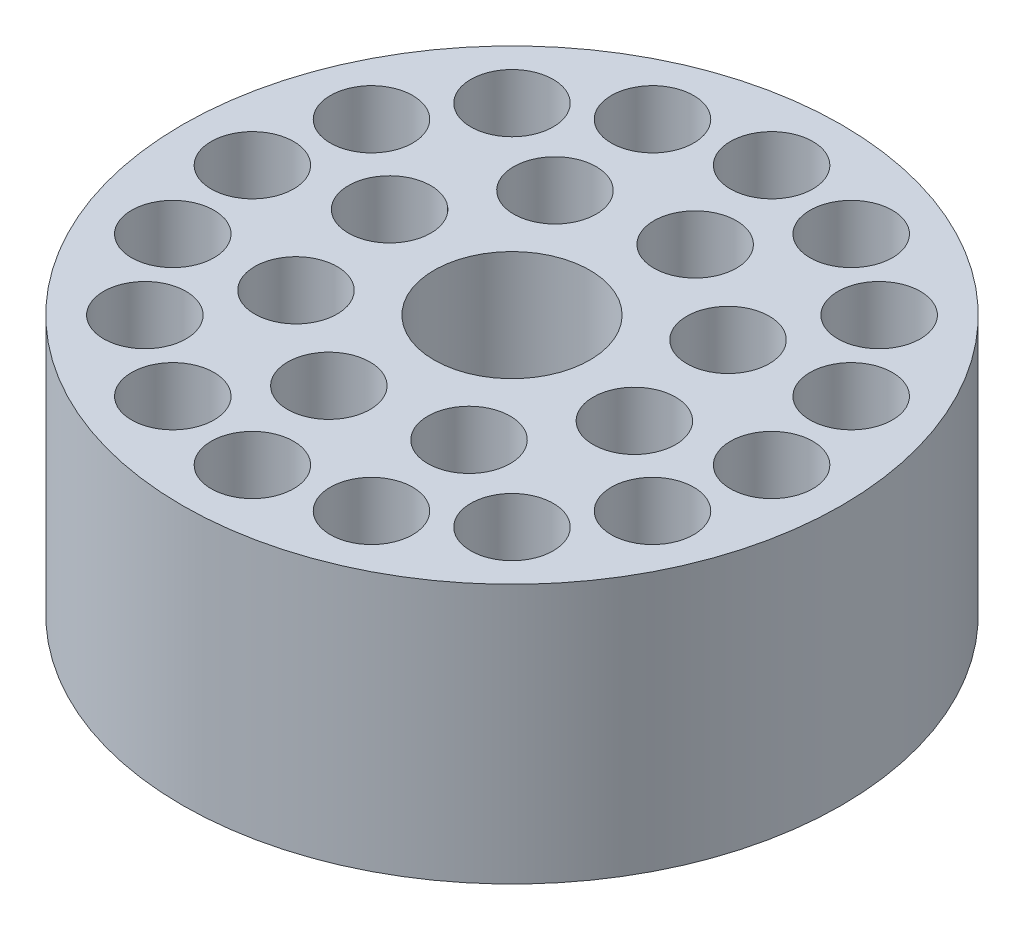
ISO-10303-21;
HEADER;
FILE_DESCRIPTION(('STEP AP214'),'2;1');
FILE_NAME('part.step','',(''),(''),'','','');
FILE_SCHEMA(('AUTOMOTIVE_DESIGN { 1 0 10303 214 1 1 1 1 }'));
ENDSEC;
DATA;
#1=APPLICATION_CONTEXT('core data for automotive mechanical design processes');
#2=APPLICATION_PROTOCOL_DEFINITION('international standard','automotive_design',2000,#1);
#3=PRODUCT_CONTEXT('',#1,'mechanical');
#4=PRODUCT('Part','Part','',(#3));
#5=PRODUCT_RELATED_PRODUCT_CATEGORY('part','',(#4));
#6=PRODUCT_DEFINITION_FORMATION('','',#4);
#7=PRODUCT_DEFINITION_CONTEXT('part definition',#1,'design');
#8=PRODUCT_DEFINITION('design','',#6,#7);
#9=PRODUCT_DEFINITION_SHAPE('','',#8);
#10=(LENGTH_UNIT() NAMED_UNIT(*) SI_UNIT(.MILLI.,.METRE.));
#11=(NAMED_UNIT(*) PLANE_ANGLE_UNIT() SI_UNIT($,.RADIAN.));
#12=(NAMED_UNIT(*) SI_UNIT($,.STERADIAN.) SOLID_ANGLE_UNIT());
#13=UNCERTAINTY_MEASURE_WITH_UNIT(LENGTH_MEASURE(1.E-05),#10,'distance_accuracy_value','');
#14=(GEOMETRIC_REPRESENTATION_CONTEXT(3) GLOBAL_UNCERTAINTY_ASSIGNED_CONTEXT((#13)) GLOBAL_UNIT_ASSIGNED_CONTEXT((#10,
#11,#12)) REPRESENTATION_CONTEXT('',''));
#15=CARTESIAN_POINT('',(0.,0.,0.));
#16=DIRECTION('',(0.,0.,1.));
#17=DIRECTION('',(1.,0.,0.));
#18=AXIS2_PLACEMENT_3D('',#15,#16,#17);
#19=CARTESIAN_POINT('',(0.,5.,0.));
#20=DIRECTION('',(0.,-1.,0.));
#21=DIRECTION('',(0.,0.,-1.));
#22=AXIS2_PLACEMENT_3D('',#19,#20,#21);
#23=CYLINDRICAL_SURFACE('',#22,6.35);
#24=CARTESIAN_POINT('',(0.,5.,0.));
#25=DIRECTION('',(0.,1.,0.));
#26=DIRECTION('',(0.,0.,1.));
#27=AXIS2_PLACEMENT_3D('',#24,#25,#26);
#28=CIRCLE('',#27,6.35);
#29=CARTESIAN_POINT('',(0.,5.,6.35));
#30=VERTEX_POINT('',#29);
#31=EDGE_CURVE('E10',#30,#30,#28,.T.);
#32=ORIENTED_EDGE('',*,*,#31,.F.);
#33=EDGE_LOOP('',(#32));
#34=FACE_BOUND('',#33,.T.);
#35=CARTESIAN_POINT('',(0.,0.,0.));
#36=DIRECTION('',(0.,1.,0.));
#37=DIRECTION('',(0.,0.,1.));
#38=AXIS2_PLACEMENT_3D('',#35,#36,#37);
#39=CIRCLE('',#38,6.35);
#40=CARTESIAN_POINT('',(0.,0.,6.35));
#41=VERTEX_POINT('',#40);
#42=EDGE_CURVE('E33',#41,#41,#39,.T.);
#43=ORIENTED_EDGE('',*,*,#42,.T.);
#44=EDGE_LOOP('',(#43));
#45=FACE_BOUND('',#44,.T.);
#46=ADVANCED_FACE('F30',(#34,#45),#23,.T.);
#47=CARTESIAN_POINT('',(0.,5.,0.));
#48=DIRECTION('',(0.,1.,0.));
#49=DIRECTION('',(0.,0.,1.));
#50=AXIS2_PLACEMENT_3D('',#47,#48,#49);
#51=PLANE('',#50);
#52=CARTESIAN_POINT('',(0.,5.,0.));
#53=DIRECTION('',(0.,1.,0.));
#54=DIRECTION('',(0.,0.,1.));
#55=AXIS2_PLACEMENT_3D('',#52,#53,#54);
#56=CIRCLE('',#55,1.5);
#57=CARTESIAN_POINT('',(0.,5.,1.5));
#58=VERTEX_POINT('',#57);
#59=EDGE_CURVE('E186',#58,#58,#56,.T.);
#60=ORIENTED_EDGE('',*,*,#59,.F.);
#61=EDGE_LOOP('',(#60));
#62=FACE_BOUND('',#61,.T.);
#63=CARTESIAN_POINT('',(2.4944088369076,5.,-1.66671069905885));
#64=DIRECTION('',(0.,1.,0.));
#65=DIRECTION('',(-0.707106781186539,0.,0.707106781186556));
#66=AXIS2_PLACEMENT_3D('',#63,#64,#65);
#67=CIRCLE('',#66,0.793750000000001);
#68=CARTESIAN_POINT('',(1.93314282934079,5.,-1.10544469149202));
#69=VERTEX_POINT('',#68);
#70=EDGE_CURVE('E180',#69,#69,#67,.T.);
#71=ORIENTED_EDGE('',*,*,#70,.F.);
#72=EDGE_LOOP('',(#71));
#73=FACE_BOUND('',#72,.T.);
#74=CARTESIAN_POINT('',(2.9423558412097,5.,0.585270966048334));
#75=DIRECTION('',(0.,1.,0.));
#76=DIRECTION('',(-1.,0.,0.));
#77=AXIS2_PLACEMENT_3D('',#74,#75,#76);
#78=CIRCLE('',#77,0.793750000000001);
#79=CARTESIAN_POINT('',(2.1486058412097,5.,0.585270966048343));
#80=VERTEX_POINT('',#79);
#81=EDGE_CURVE('E174',#80,#80,#78,.T.);
#82=ORIENTED_EDGE('',*,*,#81,.F.);
#83=EDGE_LOOP('',(#82));
#84=FACE_BOUND('',#83,.T.);
#85=CARTESIAN_POINT('',(1.66671069905885,5.,2.49440883690761));
#86=DIRECTION('',(0.,1.,0.));
#87=DIRECTION('',(-0.707106781186554,0.,-0.707106781186541));
#88=AXIS2_PLACEMENT_3D('',#85,#86,#87);
#89=CIRCLE('',#88,0.793750000000001);
#90=CARTESIAN_POINT('',(1.10544469149202,5.,1.93314282934079));
#91=VERTEX_POINT('',#90);
#92=EDGE_CURVE('E168',#91,#91,#89,.T.);
#93=ORIENTED_EDGE('',*,*,#92,.F.);
#94=EDGE_LOOP('',(#93));
#95=FACE_BOUND('',#94,.T.);
#96=CARTESIAN_POINT('',(-0.585270966048365,5.,2.9423558412097));
#97=DIRECTION('',(0.,1.,0.));
#98=DIRECTION('',(0.,0.,-1.));
#99=AXIS2_PLACEMENT_3D('',#96,#97,#98);
#100=CIRCLE('',#99,0.793750000000001);
#101=CARTESIAN_POINT('',(-0.585270966048365,5.,2.14860584120969));
#102=VERTEX_POINT('',#101);
#103=EDGE_CURVE('E162',#102,#102,#100,.T.);
#104=ORIENTED_EDGE('',*,*,#103,.F.);
#105=EDGE_LOOP('',(#104));
#106=FACE_BOUND('',#105,.T.);
#107=CARTESIAN_POINT('',(-2.49440883690762,5.,1.66671069905884));
#108=DIRECTION('',(0.,1.,0.));
#109=DIRECTION('',(0.707106781186544,0.,-0.707106781186551));
#110=AXIS2_PLACEMENT_3D('',#107,#108,#109);
#111=CIRCLE('',#110,0.793750000000001);
#112=CARTESIAN_POINT('',(-1.9331428293408,5.,1.10544469149201));
#113=VERTEX_POINT('',#112);
#114=EDGE_CURVE('E156',#113,#113,#111,.T.);
#115=ORIENTED_EDGE('',*,*,#114,.F.);
#116=EDGE_LOOP('',(#115));
#117=FACE_BOUND('',#116,.T.);
#118=CARTESIAN_POINT('',(-2.9423558412097,5.,-0.585270966048355));
#119=DIRECTION('',(0.,1.,0.));
#120=DIRECTION('',(1.,0.,0.));
#121=AXIS2_PLACEMENT_3D('',#118,#119,#120);
#122=CIRCLE('',#121,0.793750000000001);
#123=CARTESIAN_POINT('',(-2.1486058412097,5.,-0.585270966048357));
#124=VERTEX_POINT('',#123);
#125=EDGE_CURVE('E150',#124,#124,#122,.T.);
#126=ORIENTED_EDGE('',*,*,#125,.F.);
#127=EDGE_LOOP('',(#126));
#128=FACE_BOUND('',#127,.T.);
#129=CARTESIAN_POINT('',(-1.66671069905883,5.,-2.49440883690762));
#130=DIRECTION('',(0.,1.,0.));
#131=DIRECTION('',(0.707106781186549,0.,0.707106781186546));
#132=AXIS2_PLACEMENT_3D('',#129,#130,#131);
#133=CIRCLE('',#132,0.793750000000001);
#134=CARTESIAN_POINT('',(-1.105444691492,5.,-1.9331428293408));
#135=VERTEX_POINT('',#134);
#136=EDGE_CURVE('E144',#135,#135,#133,.T.);
#137=ORIENTED_EDGE('',*,*,#136,.F.);
#138=EDGE_LOOP('',(#137));
#139=FACE_BOUND('',#138,.T.);
#140=CARTESIAN_POINT('',(0.585270966048365,5.,-2.9423558412097));
#141=DIRECTION('',(0.,1.,0.));
#142=DIRECTION('',(0.,0.,1.));
#143=AXIS2_PLACEMENT_3D('',#140,#141,#142);
#144=CIRCLE('',#143,0.793750000000001);
#145=CARTESIAN_POINT('',(0.585270966048365,5.,-2.14860584120969));
#146=VERTEX_POINT('',#145);
#147=EDGE_CURVE('E138',#146,#146,#144,.T.);
#148=ORIENTED_EDGE('',*,*,#147,.F.);
#149=EDGE_LOOP('',(#148));
#150=FACE_BOUND('',#149,.T.);
#151=CARTESIAN_POINT('',(1.91341716182539,5.,-4.61939766255646));
#152=DIRECTION('',(0.,1.,0.));
#153=DIRECTION('',(-0.382683432365077,0.,0.923879532511292));
#154=AXIS2_PLACEMENT_3D('',#151,#152,#153);
#155=CIRCLE('',#154,0.79375);
#156=CARTESIAN_POINT('',(1.60966218738561,5.,-3.88606828362562));
#157=VERTEX_POINT('',#156);
#158=EDGE_CURVE('E132',#157,#157,#155,.T.);
#159=ORIENTED_EDGE('',*,*,#158,.F.);
#160=EDGE_LOOP('',(#159));
#161=FACE_BOUND('',#160,.T.);
#162=CARTESIAN_POINT('',(3.53553390593269,5.,-3.53553390593278));
#163=DIRECTION('',(0.,1.,0.));
#164=DIRECTION('',(-0.707106781186539,0.,0.707106781186556));
#165=AXIS2_PLACEMENT_3D('',#162,#163,#164);
#166=CIRCLE('',#165,0.79375);
#167=CARTESIAN_POINT('',(2.97426789836588,5.,-2.97426789836595));
#168=VERTEX_POINT('',#167);
#169=EDGE_CURVE('E126',#168,#168,#166,.T.);
#170=ORIENTED_EDGE('',*,*,#169,.F.);
#171=EDGE_LOOP('',(#170));
#172=FACE_BOUND('',#171,.T.);
#173=CARTESIAN_POINT('',(4.61939766255641,5.,-1.9134171618255));
#174=DIRECTION('',(0.,1.,0.));
#175=DIRECTION('',(-0.923879532511283,0.,0.3826834323651));
#176=AXIS2_PLACEMENT_3D('',#173,#174,#175);
#177=CIRCLE('',#176,0.79375);
#178=CARTESIAN_POINT('',(3.88606828362558,5.,-1.6096621873857));
#179=VERTEX_POINT('',#178);
#180=EDGE_CURVE('E120',#179,#179,#177,.T.);
#181=ORIENTED_EDGE('',*,*,#180,.F.);
#182=EDGE_LOOP('',(#181));
#183=FACE_BOUND('',#182,.T.);
#184=CARTESIAN_POINT('',(5.,5.,0.));
#185=DIRECTION('',(0.,1.,0.));
#186=DIRECTION('',(-1.,0.,0.));
#187=AXIS2_PLACEMENT_3D('',#184,#185,#186);
#188=CIRCLE('',#187,0.79375);
#189=CARTESIAN_POINT('',(4.20625,5.,0.));
#190=VERTEX_POINT('',#189);
#191=EDGE_CURVE('E114',#190,#190,#188,.T.);
#192=ORIENTED_EDGE('',*,*,#191,.F.);
#193=EDGE_LOOP('',(#192));
#194=FACE_BOUND('',#193,.T.);
#195=CARTESIAN_POINT('',(4.61939766255645,5.,1.9134171618254));
#196=DIRECTION('',(0.,1.,0.));
#197=DIRECTION('',(-0.923879532511291,0.,-0.382683432365081));
#198=AXIS2_PLACEMENT_3D('',#195,#196,#197);
#199=CIRCLE('',#198,0.79375);
#200=CARTESIAN_POINT('',(3.88606828362562,5.,1.60966218738562));
#201=VERTEX_POINT('',#200);
#202=EDGE_CURVE('E108',#201,#201,#199,.T.);
#203=ORIENTED_EDGE('',*,*,#202,.F.);
#204=EDGE_LOOP('',(#203));
#205=FACE_BOUND('',#204,.T.);
#206=CARTESIAN_POINT('',(3.53553390593277,5.,3.53553390593271));
#207=DIRECTION('',(0.,1.,0.));
#208=DIRECTION('',(-0.707106781186554,0.,-0.707106781186541));
#209=AXIS2_PLACEMENT_3D('',#206,#207,#208);
#210=CIRCLE('',#209,0.79375);
#211=CARTESIAN_POINT('',(2.97426789836594,5.,2.97426789836589));
#212=VERTEX_POINT('',#211);
#213=EDGE_CURVE('E102',#212,#212,#210,.T.);
#214=ORIENTED_EDGE('',*,*,#213,.F.);
#215=EDGE_LOOP('',(#214));
#216=FACE_BOUND('',#215,.T.);
#217=CARTESIAN_POINT('',(1.91341716182549,5.,4.61939766255642));
#218=DIRECTION('',(0.,1.,0.));
#219=DIRECTION('',(-0.382683432365097,0.,-0.923879532511284));
#220=AXIS2_PLACEMENT_3D('',#217,#218,#219);
#221=CIRCLE('',#220,0.79375);
#222=CARTESIAN_POINT('',(1.60966218738569,5.,3.88606828362559));
#223=VERTEX_POINT('',#222);
#224=EDGE_CURVE('E96',#223,#223,#221,.T.);
#225=ORIENTED_EDGE('',*,*,#224,.F.);
#226=EDGE_LOOP('',(#225));
#227=FACE_BOUND('',#226,.T.);
#228=CARTESIAN_POINT('',(0.,5.,5.));
#229=DIRECTION('',(0.,1.,0.));
#230=DIRECTION('',(0.,0.,-1.));
#231=AXIS2_PLACEMENT_3D('',#228,#229,#230);
#232=CIRCLE('',#231,0.79375);
#233=CARTESIAN_POINT('',(0.,5.,4.20625));
#234=VERTEX_POINT('',#233);
#235=EDGE_CURVE('E90',#234,#234,#232,.T.);
#236=ORIENTED_EDGE('',*,*,#235,.F.);
#237=EDGE_LOOP('',(#236));
#238=FACE_BOUND('',#237,.T.);
#239=CARTESIAN_POINT('',(-1.91341716182542,5.,4.61939766255645));
#240=DIRECTION('',(0.,1.,0.));
#241=DIRECTION('',(0.382683432365084,0.,-0.923879532511289));
#242=AXIS2_PLACEMENT_3D('',#239,#240,#241);
#243=CIRCLE('',#242,0.79375);
#244=CARTESIAN_POINT('',(-1.60966218738564,5.,3.88606828362561));
#245=VERTEX_POINT('',#244);
#246=EDGE_CURVE('E84',#245,#245,#243,.T.);
#247=ORIENTED_EDGE('',*,*,#246,.F.);
#248=EDGE_LOOP('',(#247));
#249=FACE_BOUND('',#248,.T.);
#250=CARTESIAN_POINT('',(-3.53553390593272,5.,3.53553390593276));
#251=DIRECTION('',(0.,1.,0.));
#252=DIRECTION('',(0.707106781186544,0.,-0.707106781186551));
#253=AXIS2_PLACEMENT_3D('',#250,#251,#252);
#254=CIRCLE('',#253,0.79375);
#255=CARTESIAN_POINT('',(-2.9742678983659,5.,2.97426789836593));
#256=VERTEX_POINT('',#255);
#257=EDGE_CURVE('E78',#256,#256,#254,.T.);
#258=ORIENTED_EDGE('',*,*,#257,.F.);
#259=EDGE_LOOP('',(#258));
#260=FACE_BOUND('',#259,.T.);
#261=CARTESIAN_POINT('',(-4.61939766255643,5.,1.91341716182547));
#262=DIRECTION('',(0.,1.,0.));
#263=DIRECTION('',(0.923879532511285,0.,-0.382683432365094));
#264=AXIS2_PLACEMENT_3D('',#261,#262,#263);
#265=CIRCLE('',#264,0.79375);
#266=CARTESIAN_POINT('',(-3.88606828362559,5.,1.60966218738568));
#267=VERTEX_POINT('',#266);
#268=EDGE_CURVE('E72',#267,#267,#265,.T.);
#269=ORIENTED_EDGE('',*,*,#268,.F.);
#270=EDGE_LOOP('',(#269));
#271=FACE_BOUND('',#270,.T.);
#272=CARTESIAN_POINT('',(-5.,5.,0.));
#273=DIRECTION('',(0.,1.,0.));
#274=DIRECTION('',(1.,0.,0.));
#275=AXIS2_PLACEMENT_3D('',#272,#273,#274);
#276=CIRCLE('',#275,0.79375);
#277=CARTESIAN_POINT('',(-4.20625,5.,0.));
#278=VERTEX_POINT('',#277);
#279=EDGE_CURVE('E66',#278,#278,#276,.T.);
#280=ORIENTED_EDGE('',*,*,#279,.F.);
#281=EDGE_LOOP('',(#280));
#282=FACE_BOUND('',#281,.T.);
#283=CARTESIAN_POINT('',(-4.61939766255644,5.,-1.91341716182544));
#284=DIRECTION('',(0.,1.,0.));
#285=DIRECTION('',(0.923879532511288,0.,0.382683432365087));
#286=AXIS2_PLACEMENT_3D('',#283,#284,#285);
#287=CIRCLE('',#286,0.79375);
#288=CARTESIAN_POINT('',(-3.8860682836256,5.,-1.60966218738565));
#289=VERTEX_POINT('',#288);
#290=EDGE_CURVE('E60',#289,#289,#287,.T.);
#291=ORIENTED_EDGE('',*,*,#290,.F.);
#292=EDGE_LOOP('',(#291));
#293=FACE_BOUND('',#292,.T.);
#294=CARTESIAN_POINT('',(-3.53553390593274,5.,-3.53553390593273));
#295=DIRECTION('',(0.,1.,0.));
#296=DIRECTION('',(0.707106781186549,0.,0.707106781186546));
#297=AXIS2_PLACEMENT_3D('',#294,#295,#296);
#298=CIRCLE('',#297,0.79375);
#299=CARTESIAN_POINT('',(-2.97426789836592,5.,-2.97426789836591));
#300=VERTEX_POINT('',#299);
#301=EDGE_CURVE('E54',#300,#300,#298,.T.);
#302=ORIENTED_EDGE('',*,*,#301,.F.);
#303=EDGE_LOOP('',(#302));
#304=FACE_BOUND('',#303,.T.);
#305=CARTESIAN_POINT('',(-1.91341716182545,5.,-4.61939766255643));
#306=DIRECTION('',(0.,1.,0.));
#307=DIRECTION('',(0.382683432365091,0.,0.923879532511287));
#308=AXIS2_PLACEMENT_3D('',#305,#306,#307);
#309=CIRCLE('',#308,0.79375);
#310=CARTESIAN_POINT('',(-1.60966218738566,5.,-3.8860682836256));
#311=VERTEX_POINT('',#310);
#312=EDGE_CURVE('E48',#311,#311,#309,.T.);
#313=ORIENTED_EDGE('',*,*,#312,.F.);
#314=EDGE_LOOP('',(#313));
#315=FACE_BOUND('',#314,.T.);
#316=CARTESIAN_POINT('',(0.,5.,-5.));
#317=DIRECTION('',(0.,1.,0.));
#318=DIRECTION('',(0.,0.,1.));
#319=AXIS2_PLACEMENT_3D('',#316,#317,#318);
#320=CIRCLE('',#319,0.79375);
#321=CARTESIAN_POINT('',(0.,5.,-4.20625));
#322=VERTEX_POINT('',#321);
#323=EDGE_CURVE('E42',#322,#322,#320,.T.);
#324=ORIENTED_EDGE('',*,*,#323,.F.);
#325=EDGE_LOOP('',(#324));
#326=FACE_BOUND('',#325,.T.);
#327=ORIENTED_EDGE('',*,*,#31,.T.);
#328=EDGE_LOOP('',(#327));
#329=FACE_BOUND('',#328,.T.);
#330=ADVANCED_FACE('F202',(#62,#73,#84,#95,#106,#117,#128,#139,#150,#161,#172,#183,#194,#205,
#216,#227,#238,#249,#260,#271,#282,#293,#304,#315,#326,#329),#51,.T.);
#331=CARTESIAN_POINT('',(0.,0.,0.));
#332=DIRECTION('',(0.,1.,0.));
#333=DIRECTION('',(0.,0.,1.));
#334=AXIS2_PLACEMENT_3D('',#331,#332,#333);
#335=PLANE('',#334);
#336=CARTESIAN_POINT('',(0.,0.,0.));
#337=DIRECTION('',(0.,1.,0.));
#338=DIRECTION('',(0.,0.,1.));
#339=AXIS2_PLACEMENT_3D('',#336,#337,#338);
#340=CIRCLE('',#339,1.5);
#341=CARTESIAN_POINT('',(0.,0.,1.5));
#342=VERTEX_POINT('',#341);
#343=EDGE_CURVE('E183',#342,#342,#340,.T.);
#344=ORIENTED_EDGE('',*,*,#343,.T.);
#345=EDGE_LOOP('',(#344));
#346=FACE_BOUND('',#345,.T.);
#347=CARTESIAN_POINT('',(2.4944088369076,0.,-1.66671069905885));
#348=DIRECTION('',(0.,1.,0.));
#349=DIRECTION('',(-0.707106781186539,0.,0.707106781186556));
#350=AXIS2_PLACEMENT_3D('',#347,#348,#349);
#351=CIRCLE('',#350,0.793750000000001);
#352=CARTESIAN_POINT('',(1.93314282934079,0.,-1.10544469149202));
#353=VERTEX_POINT('',#352);
#354=EDGE_CURVE('E177',#353,#353,#351,.T.);
#355=ORIENTED_EDGE('',*,*,#354,.T.);
#356=EDGE_LOOP('',(#355));
#357=FACE_BOUND('',#356,.T.);
#358=CARTESIAN_POINT('',(2.9423558412097,0.,0.585270966048334));
#359=DIRECTION('',(0.,1.,0.));
#360=DIRECTION('',(-1.,0.,0.));
#361=AXIS2_PLACEMENT_3D('',#358,#359,#360);
#362=CIRCLE('',#361,0.793750000000001);
#363=CARTESIAN_POINT('',(2.1486058412097,0.,0.585270966048343));
#364=VERTEX_POINT('',#363);
#365=EDGE_CURVE('E171',#364,#364,#362,.T.);
#366=ORIENTED_EDGE('',*,*,#365,.T.);
#367=EDGE_LOOP('',(#366));
#368=FACE_BOUND('',#367,.T.);
#369=CARTESIAN_POINT('',(1.66671069905885,0.,2.49440883690761));
#370=DIRECTION('',(0.,1.,0.));
#371=DIRECTION('',(-0.707106781186554,0.,-0.707106781186541));
#372=AXIS2_PLACEMENT_3D('',#369,#370,#371);
#373=CIRCLE('',#372,0.793750000000001);
#374=CARTESIAN_POINT('',(1.10544469149202,0.,1.93314282934079));
#375=VERTEX_POINT('',#374);
#376=EDGE_CURVE('E165',#375,#375,#373,.T.);
#377=ORIENTED_EDGE('',*,*,#376,.T.);
#378=EDGE_LOOP('',(#377));
#379=FACE_BOUND('',#378,.T.);
#380=CARTESIAN_POINT('',(-0.585270966048365,0.,2.9423558412097));
#381=DIRECTION('',(0.,1.,0.));
#382=DIRECTION('',(0.,0.,-1.));
#383=AXIS2_PLACEMENT_3D('',#380,#381,#382);
#384=CIRCLE('',#383,0.793750000000001);
#385=CARTESIAN_POINT('',(-0.585270966048365,0.,2.14860584120969));
#386=VERTEX_POINT('',#385);
#387=EDGE_CURVE('E159',#386,#386,#384,.T.);
#388=ORIENTED_EDGE('',*,*,#387,.T.);
#389=EDGE_LOOP('',(#388));
#390=FACE_BOUND('',#389,.T.);
#391=CARTESIAN_POINT('',(-2.49440883690762,0.,1.66671069905884));
#392=DIRECTION('',(0.,1.,0.));
#393=DIRECTION('',(0.707106781186544,0.,-0.707106781186551));
#394=AXIS2_PLACEMENT_3D('',#391,#392,#393);
#395=CIRCLE('',#394,0.793750000000001);
#396=CARTESIAN_POINT('',(-1.9331428293408,0.,1.10544469149201));
#397=VERTEX_POINT('',#396);
#398=EDGE_CURVE('E153',#397,#397,#395,.T.);
#399=ORIENTED_EDGE('',*,*,#398,.T.);
#400=EDGE_LOOP('',(#399));
#401=FACE_BOUND('',#400,.T.);
#402=CARTESIAN_POINT('',(-2.9423558412097,0.,-0.585270966048355));
#403=DIRECTION('',(0.,1.,0.));
#404=DIRECTION('',(1.,0.,0.));
#405=AXIS2_PLACEMENT_3D('',#402,#403,#404);
#406=CIRCLE('',#405,0.793750000000001);
#407=CARTESIAN_POINT('',(-2.1486058412097,0.,-0.585270966048357));
#408=VERTEX_POINT('',#407);
#409=EDGE_CURVE('E147',#408,#408,#406,.T.);
#410=ORIENTED_EDGE('',*,*,#409,.T.);
#411=EDGE_LOOP('',(#410));
#412=FACE_BOUND('',#411,.T.);
#413=CARTESIAN_POINT('',(-1.66671069905883,0.,-2.49440883690762));
#414=DIRECTION('',(0.,1.,0.));
#415=DIRECTION('',(0.707106781186549,0.,0.707106781186546));
#416=AXIS2_PLACEMENT_3D('',#413,#414,#415);
#417=CIRCLE('',#416,0.793750000000001);
#418=CARTESIAN_POINT('',(-1.105444691492,0.,-1.9331428293408));
#419=VERTEX_POINT('',#418);
#420=EDGE_CURVE('E141',#419,#419,#417,.T.);
#421=ORIENTED_EDGE('',*,*,#420,.T.);
#422=EDGE_LOOP('',(#421));
#423=FACE_BOUND('',#422,.T.);
#424=CARTESIAN_POINT('',(0.585270966048365,0.,-2.9423558412097));
#425=DIRECTION('',(0.,1.,0.));
#426=DIRECTION('',(0.,0.,1.));
#427=AXIS2_PLACEMENT_3D('',#424,#425,#426);
#428=CIRCLE('',#427,0.793750000000001);
#429=CARTESIAN_POINT('',(0.585270966048365,0.,-2.14860584120969));
#430=VERTEX_POINT('',#429);
#431=EDGE_CURVE('E135',#430,#430,#428,.T.);
#432=ORIENTED_EDGE('',*,*,#431,.T.);
#433=EDGE_LOOP('',(#432));
#434=FACE_BOUND('',#433,.T.);
#435=CARTESIAN_POINT('',(1.91341716182539,0.,-4.61939766255646));
#436=DIRECTION('',(0.,1.,0.));
#437=DIRECTION('',(-0.382683432365077,0.,0.923879532511292));
#438=AXIS2_PLACEMENT_3D('',#435,#436,#437);
#439=CIRCLE('',#438,0.79375);
#440=CARTESIAN_POINT('',(1.60966218738561,0.,-3.88606828362562));
#441=VERTEX_POINT('',#440);
#442=EDGE_CURVE('E129',#441,#441,#439,.T.);
#443=ORIENTED_EDGE('',*,*,#442,.T.);
#444=EDGE_LOOP('',(#443));
#445=FACE_BOUND('',#444,.T.);
#446=CARTESIAN_POINT('',(3.53553390593269,0.,-3.53553390593278));
#447=DIRECTION('',(0.,1.,0.));
#448=DIRECTION('',(-0.707106781186539,0.,0.707106781186556));
#449=AXIS2_PLACEMENT_3D('',#446,#447,#448);
#450=CIRCLE('',#449,0.79375);
#451=CARTESIAN_POINT('',(2.97426789836588,0.,-2.97426789836595));
#452=VERTEX_POINT('',#451);
#453=EDGE_CURVE('E123',#452,#452,#450,.T.);
#454=ORIENTED_EDGE('',*,*,#453,.T.);
#455=EDGE_LOOP('',(#454));
#456=FACE_BOUND('',#455,.T.);
#457=CARTESIAN_POINT('',(4.61939766255641,0.,-1.9134171618255));
#458=DIRECTION('',(0.,1.,0.));
#459=DIRECTION('',(-0.923879532511283,0.,0.3826834323651));
#460=AXIS2_PLACEMENT_3D('',#457,#458,#459);
#461=CIRCLE('',#460,0.79375);
#462=CARTESIAN_POINT('',(3.88606828362558,0.,-1.6096621873857));
#463=VERTEX_POINT('',#462);
#464=EDGE_CURVE('E117',#463,#463,#461,.T.);
#465=ORIENTED_EDGE('',*,*,#464,.T.);
#466=EDGE_LOOP('',(#465));
#467=FACE_BOUND('',#466,.T.);
#468=CARTESIAN_POINT('',(5.,0.,0.));
#469=DIRECTION('',(0.,1.,0.));
#470=DIRECTION('',(-1.,0.,0.));
#471=AXIS2_PLACEMENT_3D('',#468,#469,#470);
#472=CIRCLE('',#471,0.79375);
#473=CARTESIAN_POINT('',(4.20625,0.,0.));
#474=VERTEX_POINT('',#473);
#475=EDGE_CURVE('E111',#474,#474,#472,.T.);
#476=ORIENTED_EDGE('',*,*,#475,.T.);
#477=EDGE_LOOP('',(#476));
#478=FACE_BOUND('',#477,.T.);
#479=CARTESIAN_POINT('',(4.61939766255645,0.,1.9134171618254));
#480=DIRECTION('',(0.,1.,0.));
#481=DIRECTION('',(-0.923879532511291,0.,-0.382683432365081));
#482=AXIS2_PLACEMENT_3D('',#479,#480,#481);
#483=CIRCLE('',#482,0.79375);
#484=CARTESIAN_POINT('',(3.88606828362562,0.,1.60966218738562));
#485=VERTEX_POINT('',#484);
#486=EDGE_CURVE('E105',#485,#485,#483,.T.);
#487=ORIENTED_EDGE('',*,*,#486,.T.);
#488=EDGE_LOOP('',(#487));
#489=FACE_BOUND('',#488,.T.);
#490=CARTESIAN_POINT('',(3.53553390593277,0.,3.53553390593271));
#491=DIRECTION('',(0.,1.,0.));
#492=DIRECTION('',(-0.707106781186554,0.,-0.707106781186541));
#493=AXIS2_PLACEMENT_3D('',#490,#491,#492);
#494=CIRCLE('',#493,0.79375);
#495=CARTESIAN_POINT('',(2.97426789836594,0.,2.97426789836589));
#496=VERTEX_POINT('',#495);
#497=EDGE_CURVE('E99',#496,#496,#494,.T.);
#498=ORIENTED_EDGE('',*,*,#497,.T.);
#499=EDGE_LOOP('',(#498));
#500=FACE_BOUND('',#499,.T.);
#501=CARTESIAN_POINT('',(1.91341716182549,0.,4.61939766255642));
#502=DIRECTION('',(0.,1.,0.));
#503=DIRECTION('',(-0.382683432365097,0.,-0.923879532511284));
#504=AXIS2_PLACEMENT_3D('',#501,#502,#503);
#505=CIRCLE('',#504,0.79375);
#506=CARTESIAN_POINT('',(1.60966218738569,0.,3.88606828362559));
#507=VERTEX_POINT('',#506);
#508=EDGE_CURVE('E93',#507,#507,#505,.T.);
#509=ORIENTED_EDGE('',*,*,#508,.T.);
#510=EDGE_LOOP('',(#509));
#511=FACE_BOUND('',#510,.T.);
#512=CARTESIAN_POINT('',(0.,0.,5.));
#513=DIRECTION('',(0.,1.,0.));
#514=DIRECTION('',(0.,0.,-1.));
#515=AXIS2_PLACEMENT_3D('',#512,#513,#514);
#516=CIRCLE('',#515,0.79375);
#517=CARTESIAN_POINT('',(0.,0.,4.20625));
#518=VERTEX_POINT('',#517);
#519=EDGE_CURVE('E87',#518,#518,#516,.T.);
#520=ORIENTED_EDGE('',*,*,#519,.T.);
#521=EDGE_LOOP('',(#520));
#522=FACE_BOUND('',#521,.T.);
#523=CARTESIAN_POINT('',(-1.91341716182542,0.,4.61939766255645));
#524=DIRECTION('',(0.,1.,0.));
#525=DIRECTION('',(0.382683432365084,0.,-0.923879532511289));
#526=AXIS2_PLACEMENT_3D('',#523,#524,#525);
#527=CIRCLE('',#526,0.79375);
#528=CARTESIAN_POINT('',(-1.60966218738564,0.,3.88606828362561));
#529=VERTEX_POINT('',#528);
#530=EDGE_CURVE('E81',#529,#529,#527,.T.);
#531=ORIENTED_EDGE('',*,*,#530,.T.);
#532=EDGE_LOOP('',(#531));
#533=FACE_BOUND('',#532,.T.);
#534=CARTESIAN_POINT('',(-3.53553390593272,0.,3.53553390593276));
#535=DIRECTION('',(0.,1.,0.));
#536=DIRECTION('',(0.707106781186544,0.,-0.707106781186551));
#537=AXIS2_PLACEMENT_3D('',#534,#535,#536);
#538=CIRCLE('',#537,0.79375);
#539=CARTESIAN_POINT('',(-2.9742678983659,0.,2.97426789836593));
#540=VERTEX_POINT('',#539);
#541=EDGE_CURVE('E75',#540,#540,#538,.T.);
#542=ORIENTED_EDGE('',*,*,#541,.T.);
#543=EDGE_LOOP('',(#542));
#544=FACE_BOUND('',#543,.T.);
#545=CARTESIAN_POINT('',(-4.61939766255643,0.,1.91341716182547));
#546=DIRECTION('',(0.,1.,0.));
#547=DIRECTION('',(0.923879532511285,0.,-0.382683432365094));
#548=AXIS2_PLACEMENT_3D('',#545,#546,#547);
#549=CIRCLE('',#548,0.79375);
#550=CARTESIAN_POINT('',(-3.88606828362559,0.,1.60966218738568));
#551=VERTEX_POINT('',#550);
#552=EDGE_CURVE('E69',#551,#551,#549,.T.);
#553=ORIENTED_EDGE('',*,*,#552,.T.);
#554=EDGE_LOOP('',(#553));
#555=FACE_BOUND('',#554,.T.);
#556=CARTESIAN_POINT('',(-5.,0.,0.));
#557=DIRECTION('',(0.,1.,0.));
#558=DIRECTION('',(1.,0.,0.));
#559=AXIS2_PLACEMENT_3D('',#556,#557,#558);
#560=CIRCLE('',#559,0.79375);
#561=CARTESIAN_POINT('',(-4.20625,0.,0.));
#562=VERTEX_POINT('',#561);
#563=EDGE_CURVE('E63',#562,#562,#560,.T.);
#564=ORIENTED_EDGE('',*,*,#563,.T.);
#565=EDGE_LOOP('',(#564));
#566=FACE_BOUND('',#565,.T.);
#567=CARTESIAN_POINT('',(-4.61939766255644,0.,-1.91341716182544));
#568=DIRECTION('',(0.,1.,0.));
#569=DIRECTION('',(0.923879532511288,0.,0.382683432365087));
#570=AXIS2_PLACEMENT_3D('',#567,#568,#569);
#571=CIRCLE('',#570,0.79375);
#572=CARTESIAN_POINT('',(-3.8860682836256,0.,-1.60966218738565));
#573=VERTEX_POINT('',#572);
#574=EDGE_CURVE('E57',#573,#573,#571,.T.);
#575=ORIENTED_EDGE('',*,*,#574,.T.);
#576=EDGE_LOOP('',(#575));
#577=FACE_BOUND('',#576,.T.);
#578=CARTESIAN_POINT('',(-3.53553390593274,0.,-3.53553390593273));
#579=DIRECTION('',(0.,1.,0.));
#580=DIRECTION('',(0.707106781186549,0.,0.707106781186546));
#581=AXIS2_PLACEMENT_3D('',#578,#579,#580);
#582=CIRCLE('',#581,0.79375);
#583=CARTESIAN_POINT('',(-2.97426789836592,0.,-2.97426789836591));
#584=VERTEX_POINT('',#583);
#585=EDGE_CURVE('E51',#584,#584,#582,.T.);
#586=ORIENTED_EDGE('',*,*,#585,.T.);
#587=EDGE_LOOP('',(#586));
#588=FACE_BOUND('',#587,.T.);
#589=CARTESIAN_POINT('',(-1.91341716182545,0.,-4.61939766255643));
#590=DIRECTION('',(0.,1.,0.));
#591=DIRECTION('',(0.382683432365091,0.,0.923879532511287));
#592=AXIS2_PLACEMENT_3D('',#589,#590,#591);
#593=CIRCLE('',#592,0.79375);
#594=CARTESIAN_POINT('',(-1.60966218738566,0.,-3.8860682836256));
#595=VERTEX_POINT('',#594);
#596=EDGE_CURVE('E45',#595,#595,#593,.T.);
#597=ORIENTED_EDGE('',*,*,#596,.T.);
#598=EDGE_LOOP('',(#597));
#599=FACE_BOUND('',#598,.T.);
#600=CARTESIAN_POINT('',(0.,0.,-5.));
#601=DIRECTION('',(0.,1.,0.));
#602=DIRECTION('',(0.,0.,1.));
#603=AXIS2_PLACEMENT_3D('',#600,#601,#602);
#604=CIRCLE('',#603,0.79375);
#605=CARTESIAN_POINT('',(0.,0.,-4.20625));
#606=VERTEX_POINT('',#605);
#607=EDGE_CURVE('E40',#606,#606,#604,.T.);
#608=ORIENTED_EDGE('',*,*,#607,.T.);
#609=EDGE_LOOP('',(#608));
#610=FACE_BOUND('',#609,.T.);
#611=ORIENTED_EDGE('',*,*,#42,.F.);
#612=EDGE_LOOP('',(#611));
#613=FACE_BOUND('',#612,.T.);
#614=ADVANCED_FACE('F192',(#346,#357,#368,#379,#390,#401,#412,#423,#434,#445,#456,#467,#478,
#489,#500,#511,#522,#533,#544,#555,#566,#577,#588,#599,#610,#613),#335,.F.);
#615=CARTESIAN_POINT('',(0.,0.,-5.));
#616=DIRECTION('',(0.,1.,0.));
#617=DIRECTION('',(0.,0.,1.));
#618=AXIS2_PLACEMENT_3D('',#615,#616,#617);
#619=CYLINDRICAL_SURFACE('',#618,0.79375);
#620=ORIENTED_EDGE('',*,*,#607,.F.);
#621=EDGE_LOOP('',(#620));
#622=FACE_BOUND('',#621,.T.);
#623=ORIENTED_EDGE('',*,*,#323,.T.);
#624=EDGE_LOOP('',(#623));
#625=FACE_BOUND('',#624,.T.);
#626=ADVANCED_FACE('F254',(#622,#625),#619,.F.);
#627=CARTESIAN_POINT('',(-1.91341716182545,0.,-4.61939766255643));
#628=DIRECTION('',(0.,1.,0.));
#629=DIRECTION('',(0.,0.,1.));
#630=AXIS2_PLACEMENT_3D('',#627,#628,#629);
#631=CYLINDRICAL_SURFACE('',#630,0.79375);
#632=ORIENTED_EDGE('',*,*,#596,.F.);
#633=EDGE_LOOP('',(#632));
#634=FACE_BOUND('',#633,.T.);
#635=ORIENTED_EDGE('',*,*,#312,.T.);
#636=EDGE_LOOP('',(#635));
#637=FACE_BOUND('',#636,.T.);
#638=ADVANCED_FACE('F256',(#634,#637),#631,.F.);
#639=CARTESIAN_POINT('',(-3.53553390593274,0.,-3.53553390593273));
#640=DIRECTION('',(0.,1.,0.));
#641=DIRECTION('',(0.,0.,1.));
#642=AXIS2_PLACEMENT_3D('',#639,#640,#641);
#643=CYLINDRICAL_SURFACE('',#642,0.79375);
#644=ORIENTED_EDGE('',*,*,#585,.F.);
#645=EDGE_LOOP('',(#644));
#646=FACE_BOUND('',#645,.T.);
#647=ORIENTED_EDGE('',*,*,#301,.T.);
#648=EDGE_LOOP('',(#647));
#649=FACE_BOUND('',#648,.T.);
#650=ADVANCED_FACE('F263',(#646,#649),#643,.F.);
#651=CARTESIAN_POINT('',(-4.61939766255644,0.,-1.91341716182544));
#652=DIRECTION('',(0.,1.,0.));
#653=DIRECTION('',(0.,0.,1.));
#654=AXIS2_PLACEMENT_3D('',#651,#652,#653);
#655=CYLINDRICAL_SURFACE('',#654,0.79375);
#656=ORIENTED_EDGE('',*,*,#574,.F.);
#657=EDGE_LOOP('',(#656));
#658=FACE_BOUND('',#657,.T.);
#659=ORIENTED_EDGE('',*,*,#290,.T.);
#660=EDGE_LOOP('',(#659));
#661=FACE_BOUND('',#660,.T.);
#662=ADVANCED_FACE('F449',(#658,#661),#655,.F.);
#663=CARTESIAN_POINT('',(-5.,0.,0.));
#664=DIRECTION('',(0.,1.,0.));
#665=DIRECTION('',(0.,0.,1.));
#666=AXIS2_PLACEMENT_3D('',#663,#664,#665);
#667=CYLINDRICAL_SURFACE('',#666,0.79375);
#668=ORIENTED_EDGE('',*,*,#563,.F.);
#669=EDGE_LOOP('',(#668));
#670=FACE_BOUND('',#669,.T.);
#671=ORIENTED_EDGE('',*,*,#279,.T.);
#672=EDGE_LOOP('',(#671));
#673=FACE_BOUND('',#672,.T.);
#674=ADVANCED_FACE('F441',(#670,#673),#667,.F.);
#675=CARTESIAN_POINT('',(-4.61939766255643,0.,1.91341716182547));
#676=DIRECTION('',(0.,1.,0.));
#677=DIRECTION('',(0.,0.,1.));
#678=AXIS2_PLACEMENT_3D('',#675,#676,#677);
#679=CYLINDRICAL_SURFACE('',#678,0.79375);
#680=ORIENTED_EDGE('',*,*,#552,.F.);
#681=EDGE_LOOP('',(#680));
#682=FACE_BOUND('',#681,.T.);
#683=ORIENTED_EDGE('',*,*,#268,.T.);
#684=EDGE_LOOP('',(#683));
#685=FACE_BOUND('',#684,.T.);
#686=ADVANCED_FACE('F433',(#682,#685),#679,.F.);
#687=CARTESIAN_POINT('',(-3.53553390593272,0.,3.53553390593276));
#688=DIRECTION('',(0.,1.,0.));
#689=DIRECTION('',(0.,0.,1.));
#690=AXIS2_PLACEMENT_3D('',#687,#688,#689);
#691=CYLINDRICAL_SURFACE('',#690,0.79375);
#692=ORIENTED_EDGE('',*,*,#541,.F.);
#693=EDGE_LOOP('',(#692));
#694=FACE_BOUND('',#693,.T.);
#695=ORIENTED_EDGE('',*,*,#257,.T.);
#696=EDGE_LOOP('',(#695));
#697=FACE_BOUND('',#696,.T.);
#698=ADVANCED_FACE('F425',(#694,#697),#691,.F.);
#699=CARTESIAN_POINT('',(-1.91341716182542,0.,4.61939766255645));
#700=DIRECTION('',(0.,1.,0.));
#701=DIRECTION('',(0.,0.,1.));
#702=AXIS2_PLACEMENT_3D('',#699,#700,#701);
#703=CYLINDRICAL_SURFACE('',#702,0.79375);
#704=ORIENTED_EDGE('',*,*,#530,.F.);
#705=EDGE_LOOP('',(#704));
#706=FACE_BOUND('',#705,.T.);
#707=ORIENTED_EDGE('',*,*,#246,.T.);
#708=EDGE_LOOP('',(#707));
#709=FACE_BOUND('',#708,.T.);
#710=ADVANCED_FACE('F417',(#706,#709),#703,.F.);
#711=CARTESIAN_POINT('',(0.,0.,5.));
#712=DIRECTION('',(0.,1.,0.));
#713=DIRECTION('',(0.,0.,1.));
#714=AXIS2_PLACEMENT_3D('',#711,#712,#713);
#715=CYLINDRICAL_SURFACE('',#714,0.79375);
#716=ORIENTED_EDGE('',*,*,#519,.F.);
#717=EDGE_LOOP('',(#716));
#718=FACE_BOUND('',#717,.T.);
#719=ORIENTED_EDGE('',*,*,#235,.T.);
#720=EDGE_LOOP('',(#719));
#721=FACE_BOUND('',#720,.T.);
#722=ADVANCED_FACE('F409',(#718,#721),#715,.F.);
#723=CARTESIAN_POINT('',(1.91341716182549,0.,4.61939766255642));
#724=DIRECTION('',(0.,1.,0.));
#725=DIRECTION('',(0.,0.,1.));
#726=AXIS2_PLACEMENT_3D('',#723,#724,#725);
#727=CYLINDRICAL_SURFACE('',#726,0.79375);
#728=ORIENTED_EDGE('',*,*,#508,.F.);
#729=EDGE_LOOP('',(#728));
#730=FACE_BOUND('',#729,.T.);
#731=ORIENTED_EDGE('',*,*,#224,.T.);
#732=EDGE_LOOP('',(#731));
#733=FACE_BOUND('',#732,.T.);
#734=ADVANCED_FACE('F401',(#730,#733),#727,.F.);
#735=CARTESIAN_POINT('',(3.53553390593277,0.,3.53553390593271));
#736=DIRECTION('',(0.,1.,0.));
#737=DIRECTION('',(0.,0.,1.));
#738=AXIS2_PLACEMENT_3D('',#735,#736,#737);
#739=CYLINDRICAL_SURFACE('',#738,0.79375);
#740=ORIENTED_EDGE('',*,*,#497,.F.);
#741=EDGE_LOOP('',(#740));
#742=FACE_BOUND('',#741,.T.);
#743=ORIENTED_EDGE('',*,*,#213,.T.);
#744=EDGE_LOOP('',(#743));
#745=FACE_BOUND('',#744,.T.);
#746=ADVANCED_FACE('F393',(#742,#745),#739,.F.);
#747=CARTESIAN_POINT('',(4.61939766255645,0.,1.9134171618254));
#748=DIRECTION('',(0.,1.,0.));
#749=DIRECTION('',(0.,0.,1.));
#750=AXIS2_PLACEMENT_3D('',#747,#748,#749);
#751=CYLINDRICAL_SURFACE('',#750,0.79375);
#752=ORIENTED_EDGE('',*,*,#486,.F.);
#753=EDGE_LOOP('',(#752));
#754=FACE_BOUND('',#753,.T.);
#755=ORIENTED_EDGE('',*,*,#202,.T.);
#756=EDGE_LOOP('',(#755));
#757=FACE_BOUND('',#756,.T.);
#758=ADVANCED_FACE('F385',(#754,#757),#751,.F.);
#759=CARTESIAN_POINT('',(5.,0.,0.));
#760=DIRECTION('',(0.,1.,0.));
#761=DIRECTION('',(0.,0.,1.));
#762=AXIS2_PLACEMENT_3D('',#759,#760,#761);
#763=CYLINDRICAL_SURFACE('',#762,0.79375);
#764=ORIENTED_EDGE('',*,*,#475,.F.);
#765=EDGE_LOOP('',(#764));
#766=FACE_BOUND('',#765,.T.);
#767=ORIENTED_EDGE('',*,*,#191,.T.);
#768=EDGE_LOOP('',(#767));
#769=FACE_BOUND('',#768,.T.);
#770=ADVANCED_FACE('F377',(#766,#769),#763,.F.);
#771=CARTESIAN_POINT('',(4.61939766255641,0.,-1.9134171618255));
#772=DIRECTION('',(0.,1.,0.));
#773=DIRECTION('',(0.,0.,1.));
#774=AXIS2_PLACEMENT_3D('',#771,#772,#773);
#775=CYLINDRICAL_SURFACE('',#774,0.79375);
#776=ORIENTED_EDGE('',*,*,#464,.F.);
#777=EDGE_LOOP('',(#776));
#778=FACE_BOUND('',#777,.T.);
#779=ORIENTED_EDGE('',*,*,#180,.T.);
#780=EDGE_LOOP('',(#779));
#781=FACE_BOUND('',#780,.T.);
#782=ADVANCED_FACE('F369',(#778,#781),#775,.F.);
#783=CARTESIAN_POINT('',(3.53553390593269,0.,-3.53553390593278));
#784=DIRECTION('',(0.,1.,0.));
#785=DIRECTION('',(0.,0.,1.));
#786=AXIS2_PLACEMENT_3D('',#783,#784,#785);
#787=CYLINDRICAL_SURFACE('',#786,0.79375);
#788=ORIENTED_EDGE('',*,*,#453,.F.);
#789=EDGE_LOOP('',(#788));
#790=FACE_BOUND('',#789,.T.);
#791=ORIENTED_EDGE('',*,*,#169,.T.);
#792=EDGE_LOOP('',(#791));
#793=FACE_BOUND('',#792,.T.);
#794=ADVANCED_FACE('F361',(#790,#793),#787,.F.);
#795=CARTESIAN_POINT('',(1.91341716182539,0.,-4.61939766255646));
#796=DIRECTION('',(0.,1.,0.));
#797=DIRECTION('',(0.,0.,1.));
#798=AXIS2_PLACEMENT_3D('',#795,#796,#797);
#799=CYLINDRICAL_SURFACE('',#798,0.79375);
#800=ORIENTED_EDGE('',*,*,#442,.F.);
#801=EDGE_LOOP('',(#800));
#802=FACE_BOUND('',#801,.T.);
#803=ORIENTED_EDGE('',*,*,#158,.T.);
#804=EDGE_LOOP('',(#803));
#805=FACE_BOUND('',#804,.T.);
#806=ADVANCED_FACE('F353',(#802,#805),#799,.F.);
#807=CARTESIAN_POINT('',(0.585270966048365,0.,-2.9423558412097));
#808=DIRECTION('',(0.,1.,0.));
#809=DIRECTION('',(0.,0.,1.));
#810=AXIS2_PLACEMENT_3D('',#807,#808,#809);
#811=CYLINDRICAL_SURFACE('',#810,0.793750000000001);
#812=ORIENTED_EDGE('',*,*,#431,.F.);
#813=EDGE_LOOP('',(#812));
#814=FACE_BOUND('',#813,.T.);
#815=ORIENTED_EDGE('',*,*,#147,.T.);
#816=EDGE_LOOP('',(#815));
#817=FACE_BOUND('',#816,.T.);
#818=ADVANCED_FACE('F345',(#814,#817),#811,.F.);
#819=CARTESIAN_POINT('',(-1.66671069905883,0.,-2.49440883690762));
#820=DIRECTION('',(0.,1.,0.));
#821=DIRECTION('',(0.,0.,1.));
#822=AXIS2_PLACEMENT_3D('',#819,#820,#821);
#823=CYLINDRICAL_SURFACE('',#822,0.793750000000001);
#824=ORIENTED_EDGE('',*,*,#420,.F.);
#825=EDGE_LOOP('',(#824));
#826=FACE_BOUND('',#825,.T.);
#827=ORIENTED_EDGE('',*,*,#136,.T.);
#828=EDGE_LOOP('',(#827));
#829=FACE_BOUND('',#828,.T.);
#830=ADVANCED_FACE('F337',(#826,#829),#823,.F.);
#831=CARTESIAN_POINT('',(-2.9423558412097,0.,-0.585270966048355));
#832=DIRECTION('',(0.,1.,0.));
#833=DIRECTION('',(0.,0.,1.));
#834=AXIS2_PLACEMENT_3D('',#831,#832,#833);
#835=CYLINDRICAL_SURFACE('',#834,0.793750000000001);
#836=ORIENTED_EDGE('',*,*,#409,.F.);
#837=EDGE_LOOP('',(#836));
#838=FACE_BOUND('',#837,.T.);
#839=ORIENTED_EDGE('',*,*,#125,.T.);
#840=EDGE_LOOP('',(#839));
#841=FACE_BOUND('',#840,.T.);
#842=ADVANCED_FACE('F329',(#838,#841),#835,.F.);
#843=CARTESIAN_POINT('',(-2.49440883690762,0.,1.66671069905884));
#844=DIRECTION('',(0.,1.,0.));
#845=DIRECTION('',(0.,0.,1.));
#846=AXIS2_PLACEMENT_3D('',#843,#844,#845);
#847=CYLINDRICAL_SURFACE('',#846,0.793750000000001);
#848=ORIENTED_EDGE('',*,*,#398,.F.);
#849=EDGE_LOOP('',(#848));
#850=FACE_BOUND('',#849,.T.);
#851=ORIENTED_EDGE('',*,*,#114,.T.);
#852=EDGE_LOOP('',(#851));
#853=FACE_BOUND('',#852,.T.);
#854=ADVANCED_FACE('F321',(#850,#853),#847,.F.);
#855=CARTESIAN_POINT('',(-0.585270966048365,0.,2.9423558412097));
#856=DIRECTION('',(0.,1.,0.));
#857=DIRECTION('',(0.,0.,1.));
#858=AXIS2_PLACEMENT_3D('',#855,#856,#857);
#859=CYLINDRICAL_SURFACE('',#858,0.793750000000001);
#860=ORIENTED_EDGE('',*,*,#387,.F.);
#861=EDGE_LOOP('',(#860));
#862=FACE_BOUND('',#861,.T.);
#863=ORIENTED_EDGE('',*,*,#103,.T.);
#864=EDGE_LOOP('',(#863));
#865=FACE_BOUND('',#864,.T.);
#866=ADVANCED_FACE('F313',(#862,#865),#859,.F.);
#867=CARTESIAN_POINT('',(1.66671069905885,0.,2.49440883690761));
#868=DIRECTION('',(0.,1.,0.));
#869=DIRECTION('',(0.,0.,1.));
#870=AXIS2_PLACEMENT_3D('',#867,#868,#869);
#871=CYLINDRICAL_SURFACE('',#870,0.793750000000001);
#872=ORIENTED_EDGE('',*,*,#376,.F.);
#873=EDGE_LOOP('',(#872));
#874=FACE_BOUND('',#873,.T.);
#875=ORIENTED_EDGE('',*,*,#92,.T.);
#876=EDGE_LOOP('',(#875));
#877=FACE_BOUND('',#876,.T.);
#878=ADVANCED_FACE('F305',(#874,#877),#871,.F.);
#879=CARTESIAN_POINT('',(2.9423558412097,0.,0.585270966048334));
#880=DIRECTION('',(0.,1.,0.));
#881=DIRECTION('',(0.,0.,1.));
#882=AXIS2_PLACEMENT_3D('',#879,#880,#881);
#883=CYLINDRICAL_SURFACE('',#882,0.793750000000001);
#884=ORIENTED_EDGE('',*,*,#365,.F.);
#885=EDGE_LOOP('',(#884));
#886=FACE_BOUND('',#885,.T.);
#887=ORIENTED_EDGE('',*,*,#81,.T.);
#888=EDGE_LOOP('',(#887));
#889=FACE_BOUND('',#888,.T.);
#890=ADVANCED_FACE('F298',(#886,#889),#883,.F.);
#891=CARTESIAN_POINT('',(2.4944088369076,0.,-1.66671069905885));
#892=DIRECTION('',(0.,1.,0.));
#893=DIRECTION('',(0.,0.,1.));
#894=AXIS2_PLACEMENT_3D('',#891,#892,#893);
#895=CYLINDRICAL_SURFACE('',#894,0.793750000000001);
#896=ORIENTED_EDGE('',*,*,#354,.F.);
#897=EDGE_LOOP('',(#896));
#898=FACE_BOUND('',#897,.T.);
#899=ORIENTED_EDGE('',*,*,#70,.T.);
#900=EDGE_LOOP('',(#899));
#901=FACE_BOUND('',#900,.T.);
#902=ADVANCED_FACE('F198',(#898,#901),#895,.F.);
#903=CARTESIAN_POINT('',(0.,0.,0.));
#904=DIRECTION('',(0.,1.,0.));
#905=DIRECTION('',(0.,0.,1.));
#906=AXIS2_PLACEMENT_3D('',#903,#904,#905);
#907=CYLINDRICAL_SURFACE('',#906,1.5);
#908=ORIENTED_EDGE('',*,*,#343,.F.);
#909=EDGE_LOOP('',(#908));
#910=FACE_BOUND('',#909,.T.);
#911=ORIENTED_EDGE('',*,*,#59,.T.);
#912=EDGE_LOOP('',(#911));
#913=FACE_BOUND('',#912,.T.);
#914=ADVANCED_FACE('F195',(#910,#913),#907,.F.);
#915=CLOSED_SHELL('',(#46,#330,#614,#626,#638,#650,#662,#674,#686,#698,#710,#722,#734,#746,#758,
#770,#782,#794,#806,#818,#830,#842,#854,#866,#878,#890,#902,#914));
#916=MANIFOLD_SOLID_BREP('B2',#915);
#917=ADVANCED_BREP_SHAPE_REPRESENTATION('',(#18,#916),#14);
#918=SHAPE_DEFINITION_REPRESENTATION(#9,#917);
ENDSEC;
END-ISO-10303-21;
